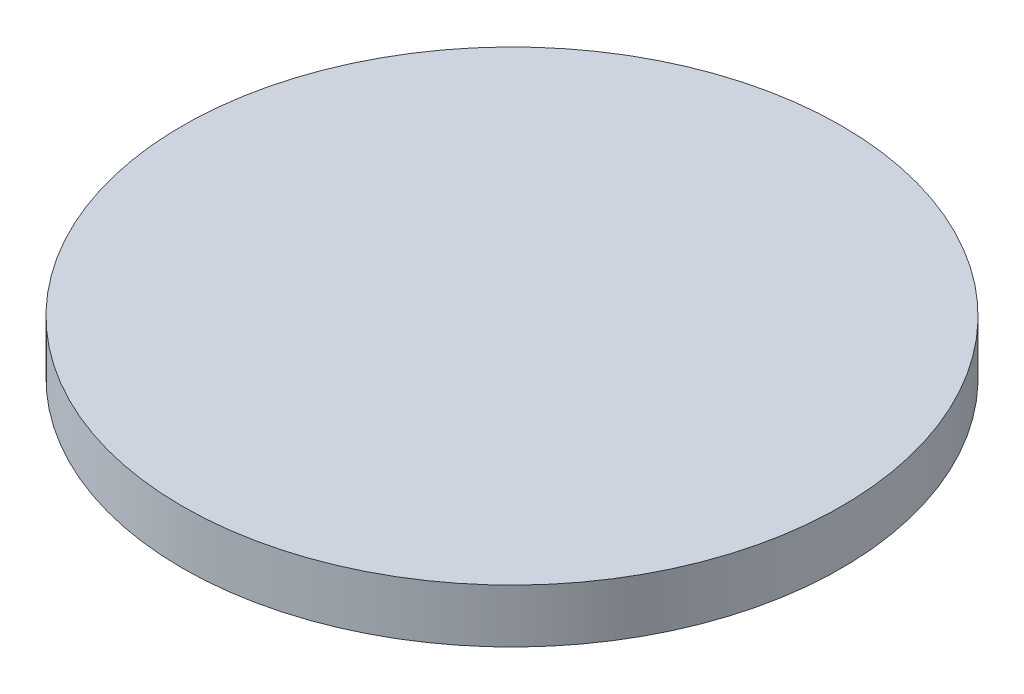
ISO-10303-21;
HEADER;
FILE_DESCRIPTION(('STEP AP214'),'2;1');
FILE_NAME('part.step','',(''),(''),'','','');
FILE_SCHEMA(('AUTOMOTIVE_DESIGN { 1 0 10303 214 1 1 1 1 }'));
ENDSEC;
DATA;
#1=APPLICATION_CONTEXT('core data for automotive mechanical design processes');
#2=APPLICATION_PROTOCOL_DEFINITION('international standard','automotive_design',2000,#1);
#3=PRODUCT_CONTEXT('',#1,'mechanical');
#4=PRODUCT('Part','Part','',(#3));
#5=PRODUCT_RELATED_PRODUCT_CATEGORY('part','',(#4));
#6=PRODUCT_DEFINITION_FORMATION('','',#4);
#7=PRODUCT_DEFINITION_CONTEXT('part definition',#1,'design');
#8=PRODUCT_DEFINITION('design','',#6,#7);
#9=PRODUCT_DEFINITION_SHAPE('','',#8);
#10=(LENGTH_UNIT() NAMED_UNIT(*) SI_UNIT(.MILLI.,.METRE.));
#11=(NAMED_UNIT(*) PLANE_ANGLE_UNIT() SI_UNIT($,.RADIAN.));
#12=(NAMED_UNIT(*) SI_UNIT($,.STERADIAN.) SOLID_ANGLE_UNIT());
#13=UNCERTAINTY_MEASURE_WITH_UNIT(LENGTH_MEASURE(1.E-05),#10,'distance_accuracy_value','');
#14=(GEOMETRIC_REPRESENTATION_CONTEXT(3) GLOBAL_UNCERTAINTY_ASSIGNED_CONTEXT((#13)) GLOBAL_UNIT_ASSIGNED_CONTEXT((#10,
#11,#12)) REPRESENTATION_CONTEXT('',''));
#15=CARTESIAN_POINT('',(0.,0.,0.));
#16=DIRECTION('',(0.,0.,1.));
#17=DIRECTION('',(1.,0.,0.));
#18=AXIS2_PLACEMENT_3D('',#15,#16,#17);
#19=CARTESIAN_POINT('',(0.,1.55,0.));
#20=DIRECTION('',(0.,-1.,0.));
#21=DIRECTION('',(0.,0.,-1.));
#22=AXIS2_PLACEMENT_3D('',#19,#20,#21);
#23=CYLINDRICAL_SURFACE('',#22,9.525);
#24=CARTESIAN_POINT('',(0.,1.55,0.));
#25=DIRECTION('',(0.,1.,0.));
#26=DIRECTION('',(0.,0.,1.));
#27=AXIS2_PLACEMENT_3D('',#24,#25,#26);
#28=CIRCLE('',#27,9.525);
#29=CARTESIAN_POINT('',(0.,1.55,-9.525));
#30=VERTEX_POINT('',#29);
#31=EDGE_CURVE('E10',#30,#30,#28,.T.);
#32=CARTESIAN_POINT('',(0.,0.,0.));
#33=DIRECTION('',(0.,1.,0.));
#34=DIRECTION('',(0.,0.,1.));
#35=AXIS2_PLACEMENT_3D('',#32,#33,#34);
#36=CIRCLE('',#35,9.525);
#37=CARTESIAN_POINT('',(0.,0.,-9.525));
#38=VERTEX_POINT('',#37);
#39=EDGE_CURVE('E34',#38,#38,#36,.T.);
#40=CARTESIAN_POINT('',(0.,1.55,-9.525));
#41=CARTESIAN_POINT('',(0.,1.53385416666667,-9.525));
#42=CARTESIAN_POINT('',(0.,1.51770833333333,-9.525));
#43=CARTESIAN_POINT('',(0.,1.48541666666667,-9.525));
#44=CARTESIAN_POINT('',(0.,1.46927083333333,-9.525));
#45=CARTESIAN_POINT('',(0.,1.43697916666667,-9.525));
#46=CARTESIAN_POINT('',(0.,1.42083333333333,-9.525));
#47=CARTESIAN_POINT('',(0.,1.38854166666667,-9.525));
#48=CARTESIAN_POINT('',(0.,1.37239583333333,-9.525));
#49=CARTESIAN_POINT('',(0.,1.34010416666667,-9.525));
#50=CARTESIAN_POINT('',(0.,1.32395833333333,-9.525));
#51=CARTESIAN_POINT('',(0.,1.29166666666667,-9.525));
#52=CARTESIAN_POINT('',(0.,1.27552083333333,-9.525));
#53=CARTESIAN_POINT('',(0.,1.24322916666667,-9.525));
#54=CARTESIAN_POINT('',(0.,1.22708333333333,-9.525));
#55=CARTESIAN_POINT('',(0.,1.19479166666667,-9.525));
#56=CARTESIAN_POINT('',(0.,1.17864583333333,-9.525));
#57=CARTESIAN_POINT('',(0.,1.14635416666667,-9.525));
#58=CARTESIAN_POINT('',(0.,1.13020833333333,-9.525));
#59=CARTESIAN_POINT('',(0.,1.09791666666667,-9.525));
#60=CARTESIAN_POINT('',(0.,1.08177083333333,-9.525));
#61=CARTESIAN_POINT('',(0.,1.04947916666667,-9.525));
#62=CARTESIAN_POINT('',(0.,1.03333333333333,-9.525));
#63=CARTESIAN_POINT('',(0.,1.00104166666667,-9.525));
#64=CARTESIAN_POINT('',(0.,0.984895833333333,-9.525));
#65=CARTESIAN_POINT('',(0.,0.952604166666667,-9.525));
#66=CARTESIAN_POINT('',(0.,0.936458333333333,-9.525));
#67=CARTESIAN_POINT('',(0.,0.904166666666667,-9.525));
#68=CARTESIAN_POINT('',(0.,0.888020833333333,-9.525));
#69=CARTESIAN_POINT('',(0.,0.855729166666667,-9.525));
#70=CARTESIAN_POINT('',(0.,0.839583333333333,-9.525));
#71=CARTESIAN_POINT('',(0.,0.807291666666667,-9.525));
#72=CARTESIAN_POINT('',(0.,0.791145833333333,-9.525));
#73=CARTESIAN_POINT('',(0.,0.758854166666667,-9.525));
#74=CARTESIAN_POINT('',(0.,0.742708333333333,-9.525));
#75=CARTESIAN_POINT('',(0.,0.710416666666667,-9.525));
#76=CARTESIAN_POINT('',(0.,0.694270833333333,-9.525));
#77=CARTESIAN_POINT('',(0.,0.661979166666667,-9.525));
#78=CARTESIAN_POINT('',(0.,0.645833333333333,-9.525));
#79=CARTESIAN_POINT('',(0.,0.613541666666667,-9.525));
#80=CARTESIAN_POINT('',(0.,0.597395833333333,-9.525));
#81=CARTESIAN_POINT('',(0.,0.565104166666667,-9.525));
#82=CARTESIAN_POINT('',(0.,0.548958333333333,-9.525));
#83=CARTESIAN_POINT('',(0.,0.516666666666667,-9.525));
#84=CARTESIAN_POINT('',(0.,0.500520833333333,-9.525));
#85=CARTESIAN_POINT('',(0.,0.468229166666667,-9.525));
#86=CARTESIAN_POINT('',(0.,0.452083333333333,-9.525));
#87=CARTESIAN_POINT('',(0.,0.419791666666667,-9.525));
#88=CARTESIAN_POINT('',(0.,0.403645833333333,-9.525));
#89=CARTESIAN_POINT('',(0.,0.371354166666667,-9.525));
#90=CARTESIAN_POINT('',(0.,0.355208333333333,-9.525));
#91=CARTESIAN_POINT('',(0.,0.322916666666667,-9.525));
#92=CARTESIAN_POINT('',(0.,0.306770833333333,-9.525));
#93=CARTESIAN_POINT('',(0.,0.274479166666667,-9.525));
#94=CARTESIAN_POINT('',(0.,0.258333333333333,-9.525));
#95=CARTESIAN_POINT('',(0.,0.226041666666667,-9.525));
#96=CARTESIAN_POINT('',(0.,0.209895833333333,-9.525));
#97=CARTESIAN_POINT('',(0.,0.177604166666667,-9.525));
#98=CARTESIAN_POINT('',(0.,0.161458333333333,-9.525));
#99=CARTESIAN_POINT('',(0.,0.129166666666667,-9.525));
#100=CARTESIAN_POINT('',(0.,0.113020833333333,-9.525));
#101=CARTESIAN_POINT('',(0.,0.0807291666666667,-9.525));
#102=CARTESIAN_POINT('',(0.,0.0645833333333334,-9.525));
#103=CARTESIAN_POINT('',(0.,0.0322916666666667,-9.525));
#104=CARTESIAN_POINT('',(0.,0.0161458333333334,-9.525));
#105=CARTESIAN_POINT('',(0.,0.,-9.525));
#106=B_SPLINE_CURVE_WITH_KNOTS('',3,(#40,#41,#42,#43,#44,#45,#46,#47,#48,#49,#50,#51,#52,#53,
#54,#55,#56,#57,#58,#59,#60,#61,#62,#63,#64,#65,#66,#67,#68,#69,#70,#71,#72,#73,#74,#75,#76,#77,
#78,#79,#80,#81,#82,#83,#84,#85,#86,#87,#88,#89,#90,#91,#92,#93,#94,#95,#96,#97,#98,#99,#100,
#101,#102,#103,#104,#105),.UNSPECIFIED.,.F.,.F.,(4,2,2,2,2,2,2,2,2,2,2,2,2,2,2,2,2,2,2,2,2,2,2,
2,2,2,2,2,2,2,2,2,4),(0.,0.0484374999999999,0.096875,0.1453125,0.19375,0.2421875,0.290625,
0.3390625,0.3875,0.4359375,0.484375,0.5328125,0.58125,0.6296875,0.678125,0.7265625,0.775,
0.8234375,0.871875,0.9203125,0.96875,1.0171875,1.065625,1.1140625,1.1625,1.2109375,1.259375,
1.3078125,1.35625,1.4046875,1.453125,1.5015625,1.55),.UNSPECIFIED.);
#107=EDGE_CURVE('BSEAM31',#30,#38,#106,.T.);
#108=ORIENTED_EDGE('',*,*,#31,.F.);
#109=ORIENTED_EDGE('',*,*,#39,.T.);
#110=ORIENTED_EDGE('',*,*,#107,.T.);
#111=ORIENTED_EDGE('',*,*,#107,.F.);
#112=EDGE_LOOP('',(#108,#110,#109,#111));
#113=FACE_BOUND('',#112,.T.);
#114=ADVANCED_FACE('F31',(#113),#23,.T.);
#115=CARTESIAN_POINT('',(0.,1.55,0.));
#116=DIRECTION('',(0.,1.,0.));
#117=DIRECTION('',(0.,0.,1.));
#118=AXIS2_PLACEMENT_3D('',#115,#116,#117);
#119=PLANE('',#118);
#120=ORIENTED_EDGE('',*,*,#31,.T.);
#121=EDGE_LOOP('',(#120));
#122=FACE_BOUND('',#121,.T.);
#123=ADVANCED_FACE('F46',(#122),#119,.T.);
#124=CARTESIAN_POINT('',(0.,0.,0.));
#125=DIRECTION('',(0.,1.,0.));
#126=DIRECTION('',(0.,0.,1.));
#127=AXIS2_PLACEMENT_3D('',#124,#125,#126);
#128=PLANE('',#127);
#129=ORIENTED_EDGE('',*,*,#39,.F.);
#130=EDGE_LOOP('',(#129));
#131=FACE_BOUND('',#130,.T.);
#132=ADVANCED_FACE('F44',(#131),#128,.F.);
#133=CLOSED_SHELL('',(#114,#123,#132));
#134=MANIFOLD_SOLID_BREP('B2',#133);
#135=ADVANCED_BREP_SHAPE_REPRESENTATION('',(#18,#134),#14);
#136=SHAPE_DEFINITION_REPRESENTATION(#9,#135);
ENDSEC;
END-ISO-10303-21;
